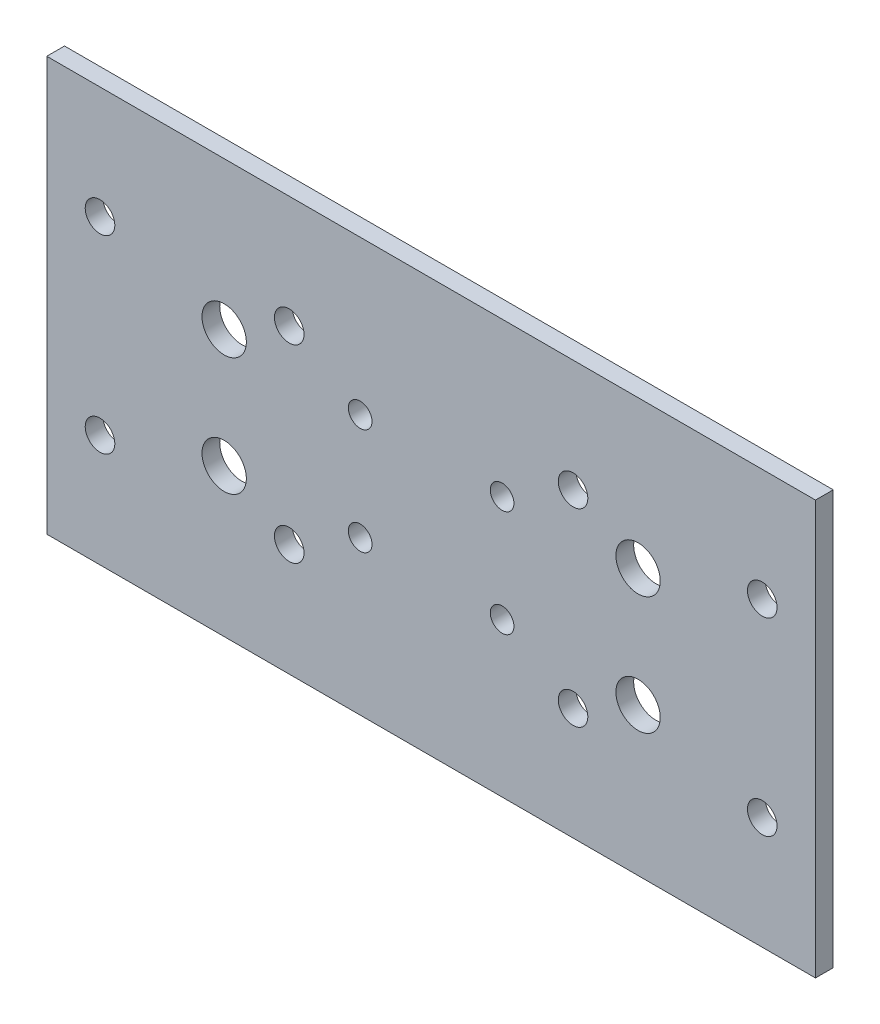
ISO-10303-21;
HEADER;
FILE_DESCRIPTION(('STEP AP214'),'2;1');
FILE_NAME('part.step','',(''),(''),'','','');
FILE_SCHEMA(('AUTOMOTIVE_DESIGN { 1 0 10303 214 1 1 1 1 }'));
ENDSEC;
DATA;
#1=APPLICATION_CONTEXT('core data for automotive mechanical design processes');
#2=APPLICATION_PROTOCOL_DEFINITION('international standard','automotive_design',2000,#1);
#3=PRODUCT_CONTEXT('',#1,'mechanical');
#4=PRODUCT('Part','Part','',(#3));
#5=PRODUCT_RELATED_PRODUCT_CATEGORY('part','',(#4));
#6=PRODUCT_DEFINITION_FORMATION('','',#4);
#7=PRODUCT_DEFINITION_CONTEXT('part definition',#1,'design');
#8=PRODUCT_DEFINITION('design','',#6,#7);
#9=PRODUCT_DEFINITION_SHAPE('','',#8);
#10=(LENGTH_UNIT() NAMED_UNIT(*) SI_UNIT(.MILLI.,.METRE.));
#11=(NAMED_UNIT(*) PLANE_ANGLE_UNIT() SI_UNIT($,.RADIAN.));
#12=(NAMED_UNIT(*) SI_UNIT($,.STERADIAN.) SOLID_ANGLE_UNIT());
#13=UNCERTAINTY_MEASURE_WITH_UNIT(LENGTH_MEASURE(1.E-05),#10,'distance_accuracy_value','');
#14=(GEOMETRIC_REPRESENTATION_CONTEXT(3) GLOBAL_UNCERTAINTY_ASSIGNED_CONTEXT((#13)) GLOBAL_UNIT_ASSIGNED_CONTEXT((#10,
#11,#12)) REPRESENTATION_CONTEXT('',''));
#15=CARTESIAN_POINT('',(0.,0.,0.));
#16=DIRECTION('',(0.,0.,1.));
#17=DIRECTION('',(1.,0.,0.));
#18=AXIS2_PLACEMENT_3D('',#15,#16,#17);
#19=CARTESIAN_POINT('',(65.,-35.,3.));
#20=DIRECTION('',(-1.,0.,0.));
#21=DIRECTION('',(0.,0.,1.));
#22=AXIS2_PLACEMENT_3D('',#19,#20,#21);
#23=PLANE('',#22);
#24=DIRECTION('',(0.,1.,0.));
#25=VECTOR('',#24,1.);
#26=CARTESIAN_POINT('',(65.,-35.,0.));
#27=LINE('',#26,#25);
#28=CARTESIAN_POINT('',(65.,-35.,0.));
#29=VERTEX_POINT('',#28);
#30=CARTESIAN_POINT('',(65.,35.,0.));
#31=VERTEX_POINT('',#30);
#32=EDGE_CURVE('E104',#29,#31,#27,.T.);
#33=ORIENTED_EDGE('',*,*,#32,.T.);
#34=DIRECTION('',(0.,0.,-1.));
#35=VECTOR('',#34,1.);
#36=CARTESIAN_POINT('',(65.,35.,3.));
#37=LINE('',#36,#35);
#38=CARTESIAN_POINT('',(65.,35.,3.));
#39=VERTEX_POINT('',#38);
#40=EDGE_CURVE('E11',#39,#31,#37,.T.);
#41=ORIENTED_EDGE('',*,*,#40,.F.);
#42=DIRECTION('',(0.,1.,0.));
#43=VECTOR('',#42,1.);
#44=CARTESIAN_POINT('',(65.,-35.,3.));
#45=LINE('',#44,#43);
#46=CARTESIAN_POINT('',(65.,-35.,3.));
#47=VERTEX_POINT('',#46);
#48=EDGE_CURVE('E92',#47,#39,#45,.T.);
#49=ORIENTED_EDGE('',*,*,#48,.F.);
#50=DIRECTION('',(0.,0.,-1.));
#51=VECTOR('',#50,1.);
#52=CARTESIAN_POINT('',(65.,-35.,3.));
#53=LINE('',#52,#51);
#54=EDGE_CURVE('E100',#47,#29,#53,.T.);
#55=ORIENTED_EDGE('',*,*,#54,.T.);
#56=EDGE_LOOP('',(#33,#41,#49,#55));
#57=FACE_BOUND('',#56,.T.);
#58=ADVANCED_FACE('F41',(#57),#23,.F.);
#59=CARTESIAN_POINT('',(-65.,35.,3.));
#60=DIRECTION('',(0.,-1.,0.));
#61=DIRECTION('',(0.,0.,-1.));
#62=AXIS2_PLACEMENT_3D('',#59,#60,#61);
#63=PLANE('',#62);
#64=DIRECTION('',(-1.,0.,0.));
#65=VECTOR('',#64,1.);
#66=CARTESIAN_POINT('',(-65.,35.,0.));
#67=LINE('',#66,#65);
#68=CARTESIAN_POINT('',(-65.,35.,0.));
#69=VERTEX_POINT('',#68);
#70=EDGE_CURVE('E96',#31,#69,#67,.T.);
#71=ORIENTED_EDGE('',*,*,#70,.T.);
#72=DIRECTION('',(0.,0.,-1.));
#73=VECTOR('',#72,1.);
#74=CARTESIAN_POINT('',(-65.,35.,3.));
#75=LINE('',#74,#73);
#76=CARTESIAN_POINT('',(-65.,35.,3.));
#77=VERTEX_POINT('',#76);
#78=EDGE_CURVE('E49',#77,#69,#75,.T.);
#79=ORIENTED_EDGE('',*,*,#78,.F.);
#80=DIRECTION('',(-1.,0.,0.));
#81=VECTOR('',#80,1.);
#82=CARTESIAN_POINT('',(-65.,35.,3.));
#83=LINE('',#82,#81);
#84=EDGE_CURVE('E87',#39,#77,#83,.T.);
#85=ORIENTED_EDGE('',*,*,#84,.F.);
#86=ORIENTED_EDGE('',*,*,#40,.T.);
#87=EDGE_LOOP('',(#71,#79,#85,#86));
#88=FACE_BOUND('',#87,.T.);
#89=ADVANCED_FACE('F95',(#88),#63,.F.);
#90=CARTESIAN_POINT('',(-65.,-35.,3.));
#91=DIRECTION('',(1.,0.,0.));
#92=DIRECTION('',(0.,0.,-1.));
#93=AXIS2_PLACEMENT_3D('',#90,#91,#92);
#94=PLANE('',#93);
#95=DIRECTION('',(0.,-1.,0.));
#96=VECTOR('',#95,1.);
#97=CARTESIAN_POINT('',(-65.,-35.,0.));
#98=LINE('',#97,#96);
#99=CARTESIAN_POINT('',(-65.,-35.,0.));
#100=VERTEX_POINT('',#99);
#101=EDGE_CURVE('E74',#69,#100,#98,.T.);
#102=ORIENTED_EDGE('',*,*,#101,.T.);
#103=DIRECTION('',(0.,0.,-1.));
#104=VECTOR('',#103,1.);
#105=CARTESIAN_POINT('',(-65.,-35.,3.));
#106=LINE('',#105,#104);
#107=CARTESIAN_POINT('',(-65.,-35.,3.));
#108=VERTEX_POINT('',#107);
#109=EDGE_CURVE('E97',#108,#100,#106,.T.);
#110=ORIENTED_EDGE('',*,*,#109,.F.);
#111=DIRECTION('',(0.,-1.,0.));
#112=VECTOR('',#111,1.);
#113=CARTESIAN_POINT('',(-65.,-35.,3.));
#114=LINE('',#113,#112);
#115=EDGE_CURVE('E90',#77,#108,#114,.T.);
#116=ORIENTED_EDGE('',*,*,#115,.F.);
#117=ORIENTED_EDGE('',*,*,#78,.T.);
#118=EDGE_LOOP('',(#102,#110,#116,#117));
#119=FACE_BOUND('',#118,.T.);
#120=ADVANCED_FACE('F98',(#119),#94,.F.);
#121=CARTESIAN_POINT('',(-65.,-35.,3.));
#122=DIRECTION('',(0.,1.,0.));
#123=DIRECTION('',(0.,0.,1.));
#124=AXIS2_PLACEMENT_3D('',#121,#122,#123);
#125=PLANE('',#124);
#126=DIRECTION('',(1.,0.,0.));
#127=VECTOR('',#126,1.);
#128=CARTESIAN_POINT('',(-65.,-35.,0.));
#129=LINE('',#128,#127);
#130=EDGE_CURVE('E80',#100,#29,#129,.T.);
#131=ORIENTED_EDGE('',*,*,#130,.T.);
#132=ORIENTED_EDGE('',*,*,#54,.F.);
#133=DIRECTION('',(1.,0.,0.));
#134=VECTOR('',#133,1.);
#135=CARTESIAN_POINT('',(-65.,-35.,3.));
#136=LINE('',#135,#134);
#137=EDGE_CURVE('E57',#108,#47,#136,.T.);
#138=ORIENTED_EDGE('',*,*,#137,.F.);
#139=ORIENTED_EDGE('',*,*,#109,.T.);
#140=EDGE_LOOP('',(#131,#132,#138,#139));
#141=FACE_BOUND('',#140,.T.);
#142=ADVANCED_FACE('F112',(#141),#125,.F.);
#143=CARTESIAN_POINT('',(0.,0.,3.));
#144=DIRECTION('',(0.,0.,-1.));
#145=DIRECTION('',(-1.,0.,0.));
#146=AXIS2_PLACEMENT_3D('',#143,#144,#145);
#147=PLANE('',#146);
#148=CARTESIAN_POINT('',(-35.,-10.,3.));
#149=DIRECTION('',(0.,0.,-1.));
#150=DIRECTION('',(-1.,0.,0.));
#151=AXIS2_PLACEMENT_3D('',#148,#149,#150);
#152=CIRCLE('',#151,3.75);
#153=CARTESIAN_POINT('',(-38.75,-10.,3.));
#154=VERTEX_POINT('',#153);
#155=EDGE_CURVE('E199',#154,#154,#152,.T.);
#156=ORIENTED_EDGE('',*,*,#155,.T.);
#157=EDGE_LOOP('',(#156));
#158=FACE_BOUND('',#157,.T.);
#159=CARTESIAN_POINT('',(35.,-10.,3.));
#160=DIRECTION('',(0.,0.,-1.));
#161=DIRECTION('',(-1.,0.,0.));
#162=AXIS2_PLACEMENT_3D('',#159,#160,#161);
#163=CIRCLE('',#162,3.75);
#164=CARTESIAN_POINT('',(31.25,-10.,3.));
#165=VERTEX_POINT('',#164);
#166=EDGE_CURVE('E205',#165,#165,#163,.T.);
#167=ORIENTED_EDGE('',*,*,#166,.T.);
#168=EDGE_LOOP('',(#167));
#169=FACE_BOUND('',#168,.T.);
#170=CARTESIAN_POINT('',(35.,10.,3.));
#171=DIRECTION('',(0.,0.,-1.));
#172=DIRECTION('',(-1.,0.,0.));
#173=AXIS2_PLACEMENT_3D('',#170,#171,#172);
#174=CIRCLE('',#173,3.75);
#175=CARTESIAN_POINT('',(31.25,10.,3.));
#176=VERTEX_POINT('',#175);
#177=EDGE_CURVE('E193',#176,#176,#174,.T.);
#178=ORIENTED_EDGE('',*,*,#177,.T.);
#179=EDGE_LOOP('',(#178));
#180=FACE_BOUND('',#179,.T.);
#181=CARTESIAN_POINT('',(-35.,10.,3.));
#182=DIRECTION('',(0.,0.,-1.));
#183=DIRECTION('',(-1.,0.,0.));
#184=AXIS2_PLACEMENT_3D('',#181,#182,#183);
#185=CIRCLE('',#184,3.75);
#186=CARTESIAN_POINT('',(-38.75,10.,3.));
#187=VERTEX_POINT('',#186);
#188=EDGE_CURVE('E176',#187,#187,#185,.T.);
#189=ORIENTED_EDGE('',*,*,#188,.T.);
#190=EDGE_LOOP('',(#189));
#191=FACE_BOUND('',#190,.T.);
#192=CARTESIAN_POINT('',(-12.,9.,3.));
#193=DIRECTION('',(0.,0.,-1.));
#194=DIRECTION('',(-1.,0.,0.));
#195=AXIS2_PLACEMENT_3D('',#192,#193,#194);
#196=CIRCLE('',#195,2.);
#197=CARTESIAN_POINT('',(-14.,9.,3.));
#198=VERTEX_POINT('',#197);
#199=EDGE_CURVE('E151',#198,#198,#196,.T.);
#200=ORIENTED_EDGE('',*,*,#199,.T.);
#201=EDGE_LOOP('',(#200));
#202=FACE_BOUND('',#201,.T.);
#203=CARTESIAN_POINT('',(56.0000000000001,15.9999999999996,3.));
#204=DIRECTION('',(0.,0.,-1.));
#205=DIRECTION('',(1.,0.,0.));
#206=AXIS2_PLACEMENT_3D('',#203,#204,#205);
#207=CIRCLE('',#206,2.50000000000002);
#208=CARTESIAN_POINT('',(58.5000000000001,15.9999999999996,3.));
#209=VERTEX_POINT('',#208);
#210=EDGE_CURVE('E158',#209,#209,#207,.T.);
#211=ORIENTED_EDGE('',*,*,#210,.T.);
#212=EDGE_LOOP('',(#211));
#213=FACE_BOUND('',#212,.T.);
#214=CARTESIAN_POINT('',(55.9999999999999,-16.0000000000004,3.));
#215=DIRECTION('',(0.,0.,-1.));
#216=DIRECTION('',(1.,0.,0.));
#217=AXIS2_PLACEMENT_3D('',#214,#215,#216);
#218=CIRCLE('',#217,2.5);
#219=CARTESIAN_POINT('',(58.4999999999999,-16.0000000000004,3.));
#220=VERTEX_POINT('',#219);
#221=EDGE_CURVE('E164',#220,#220,#218,.T.);
#222=ORIENTED_EDGE('',*,*,#221,.T.);
#223=EDGE_LOOP('',(#222));
#224=FACE_BOUND('',#223,.T.);
#225=CARTESIAN_POINT('',(23.9999999999999,-16.0000000000002,3.));
#226=DIRECTION('',(0.,0.,-1.));
#227=DIRECTION('',(1.,0.,0.));
#228=AXIS2_PLACEMENT_3D('',#225,#226,#227);
#229=CIRCLE('',#228,2.50000000000001);
#230=CARTESIAN_POINT('',(26.4999999999999,-16.0000000000002,3.));
#231=VERTEX_POINT('',#230);
#232=EDGE_CURVE('E128',#231,#231,#229,.T.);
#233=ORIENTED_EDGE('',*,*,#232,.T.);
#234=EDGE_LOOP('',(#233));
#235=FACE_BOUND('',#234,.T.);
#236=CARTESIAN_POINT('',(24.0000000000001,16.,3.));
#237=DIRECTION('',(0.,0.,-1.));
#238=DIRECTION('',(1.,0.,0.));
#239=AXIS2_PLACEMENT_3D('',#236,#237,#238);
#240=CIRCLE('',#239,2.5);
#241=CARTESIAN_POINT('',(26.5000000000001,16.,3.));
#242=VERTEX_POINT('',#241);
#243=EDGE_CURVE('E127',#242,#242,#240,.T.);
#244=ORIENTED_EDGE('',*,*,#243,.T.);
#245=EDGE_LOOP('',(#244));
#246=FACE_BOUND('',#245,.T.);
#247=CARTESIAN_POINT('',(-24.,16.,3.));
#248=DIRECTION('',(0.,0.,-1.));
#249=DIRECTION('',(-1.,0.,0.));
#250=AXIS2_PLACEMENT_3D('',#247,#248,#249);
#251=CIRCLE('',#250,2.5);
#252=CARTESIAN_POINT('',(-26.5,16.,3.));
#253=VERTEX_POINT('',#252);
#254=EDGE_CURVE('E134',#253,#253,#251,.T.);
#255=ORIENTED_EDGE('',*,*,#254,.T.);
#256=EDGE_LOOP('',(#255));
#257=FACE_BOUND('',#256,.T.);
#258=CARTESIAN_POINT('',(-24.,-16.,3.));
#259=DIRECTION('',(0.,0.,-1.));
#260=DIRECTION('',(-1.,0.,0.));
#261=AXIS2_PLACEMENT_3D('',#258,#259,#260);
#262=CIRCLE('',#261,2.5);
#263=CARTESIAN_POINT('',(-26.5,-16.,3.));
#264=VERTEX_POINT('',#263);
#265=EDGE_CURVE('E140',#264,#264,#262,.T.);
#266=ORIENTED_EDGE('',*,*,#265,.T.);
#267=EDGE_LOOP('',(#266));
#268=FACE_BOUND('',#267,.T.);
#269=CARTESIAN_POINT('',(-56.,-16.,3.));
#270=DIRECTION('',(0.,0.,-1.));
#271=DIRECTION('',(-1.,0.,0.));
#272=AXIS2_PLACEMENT_3D('',#269,#270,#271);
#273=CIRCLE('',#272,2.5);
#274=CARTESIAN_POINT('',(-58.5,-16.,3.));
#275=VERTEX_POINT('',#274);
#276=EDGE_CURVE('E121',#275,#275,#273,.T.);
#277=ORIENTED_EDGE('',*,*,#276,.T.);
#278=EDGE_LOOP('',(#277));
#279=FACE_BOUND('',#278,.T.);
#280=CARTESIAN_POINT('',(12.,9.,3.));
#281=DIRECTION('',(0.,0.,-1.));
#282=DIRECTION('',(1.,0.,0.));
#283=AXIS2_PLACEMENT_3D('',#280,#281,#282);
#284=CIRCLE('',#283,2.00000000000008);
#285=CARTESIAN_POINT('',(14.0000000000001,9.,3.));
#286=VERTEX_POINT('',#285);
#287=EDGE_CURVE('E152',#286,#286,#284,.T.);
#288=ORIENTED_EDGE('',*,*,#287,.T.);
#289=EDGE_LOOP('',(#288));
#290=FACE_BOUND('',#289,.T.);
#291=CARTESIAN_POINT('',(12.,-9.,3.));
#292=DIRECTION('',(0.,0.,-1.));
#293=DIRECTION('',(-1.,0.,0.));
#294=AXIS2_PLACEMENT_3D('',#291,#292,#293);
#295=CIRCLE('',#294,2.00000000000008);
#296=CARTESIAN_POINT('',(9.99999999999992,-9.,3.));
#297=VERTEX_POINT('',#296);
#298=EDGE_CURVE('E182',#297,#297,#295,.T.);
#299=ORIENTED_EDGE('',*,*,#298,.T.);
#300=EDGE_LOOP('',(#299));
#301=FACE_BOUND('',#300,.T.);
#302=CARTESIAN_POINT('',(-12.,-9.,3.));
#303=DIRECTION('',(0.,0.,-1.));
#304=DIRECTION('',(1.,0.,0.));
#305=AXIS2_PLACEMENT_3D('',#302,#303,#304);
#306=CIRCLE('',#305,2.);
#307=CARTESIAN_POINT('',(-10.,-9.,3.));
#308=VERTEX_POINT('',#307);
#309=EDGE_CURVE('E175',#308,#308,#306,.T.);
#310=ORIENTED_EDGE('',*,*,#309,.T.);
#311=EDGE_LOOP('',(#310));
#312=FACE_BOUND('',#311,.T.);
#313=CARTESIAN_POINT('',(-56.,16.,3.));
#314=DIRECTION('',(0.,0.,-1.));
#315=DIRECTION('',(-1.,0.,0.));
#316=AXIS2_PLACEMENT_3D('',#313,#314,#315);
#317=CIRCLE('',#316,2.5);
#318=CARTESIAN_POINT('',(-58.5,16.,3.));
#319=VERTEX_POINT('',#318);
#320=EDGE_CURVE('E107',#319,#319,#317,.T.);
#321=ORIENTED_EDGE('',*,*,#320,.T.);
#322=EDGE_LOOP('',(#321));
#323=FACE_BOUND('',#322,.T.);
#324=ORIENTED_EDGE('',*,*,#48,.T.);
#325=ORIENTED_EDGE('',*,*,#84,.T.);
#326=ORIENTED_EDGE('',*,*,#115,.T.);
#327=ORIENTED_EDGE('',*,*,#137,.T.);
#328=EDGE_LOOP('',(#324,#325,#326,#327));
#329=FACE_BOUND('',#328,.T.);
#330=ADVANCED_FACE('F88',(#158,#169,#180,#191,#202,#213,#224,#235,#246,#257,#268,#279,#290,#301,
#312,#323,#329),#147,.F.);
#331=CARTESIAN_POINT('',(0.,0.,0.));
#332=DIRECTION('',(0.,0.,-1.));
#333=DIRECTION('',(-1.,0.,0.));
#334=AXIS2_PLACEMENT_3D('',#331,#332,#333);
#335=PLANE('',#334);
#336=CARTESIAN_POINT('',(-35.,-10.,0.));
#337=DIRECTION('',(0.,0.,-1.));
#338=DIRECTION('',(-1.,0.,0.));
#339=AXIS2_PLACEMENT_3D('',#336,#337,#338);
#340=CIRCLE('',#339,3.75);
#341=CARTESIAN_POINT('',(-38.75,-10.,0.));
#342=VERTEX_POINT('',#341);
#343=EDGE_CURVE('E196',#342,#342,#340,.T.);
#344=ORIENTED_EDGE('',*,*,#343,.F.);
#345=EDGE_LOOP('',(#344));
#346=FACE_BOUND('',#345,.T.);
#347=CARTESIAN_POINT('',(35.,-10.,0.));
#348=DIRECTION('',(0.,0.,-1.));
#349=DIRECTION('',(-1.,0.,0.));
#350=AXIS2_PLACEMENT_3D('',#347,#348,#349);
#351=CIRCLE('',#350,3.75);
#352=CARTESIAN_POINT('',(31.25,-10.,0.));
#353=VERTEX_POINT('',#352);
#354=EDGE_CURVE('E202',#353,#353,#351,.T.);
#355=ORIENTED_EDGE('',*,*,#354,.F.);
#356=EDGE_LOOP('',(#355));
#357=FACE_BOUND('',#356,.T.);
#358=CARTESIAN_POINT('',(35.,10.,0.));
#359=DIRECTION('',(0.,0.,-1.));
#360=DIRECTION('',(-1.,0.,0.));
#361=AXIS2_PLACEMENT_3D('',#358,#359,#360);
#362=CIRCLE('',#361,3.75);
#363=CARTESIAN_POINT('',(31.25,10.,0.));
#364=VERTEX_POINT('',#363);
#365=EDGE_CURVE('E208',#364,#364,#362,.T.);
#366=ORIENTED_EDGE('',*,*,#365,.F.);
#367=EDGE_LOOP('',(#366));
#368=FACE_BOUND('',#367,.T.);
#369=CARTESIAN_POINT('',(-35.,10.,0.));
#370=DIRECTION('',(0.,0.,-1.));
#371=DIRECTION('',(-1.,0.,0.));
#372=AXIS2_PLACEMENT_3D('',#369,#370,#371);
#373=CIRCLE('',#372,3.75);
#374=CARTESIAN_POINT('',(-38.75,10.,0.));
#375=VERTEX_POINT('',#374);
#376=EDGE_CURVE('E190',#375,#375,#373,.T.);
#377=ORIENTED_EDGE('',*,*,#376,.F.);
#378=EDGE_LOOP('',(#377));
#379=FACE_BOUND('',#378,.T.);
#380=CARTESIAN_POINT('',(-12.,9.,0.));
#381=DIRECTION('',(0.,0.,-1.));
#382=DIRECTION('',(-1.,0.,0.));
#383=AXIS2_PLACEMENT_3D('',#380,#381,#382);
#384=CIRCLE('',#383,2.);
#385=CARTESIAN_POINT('',(-14.,9.,0.));
#386=VERTEX_POINT('',#385);
#387=EDGE_CURVE('E148',#386,#386,#384,.T.);
#388=ORIENTED_EDGE('',*,*,#387,.F.);
#389=EDGE_LOOP('',(#388));
#390=FACE_BOUND('',#389,.T.);
#391=CARTESIAN_POINT('',(56.0000000000001,15.9999999999996,0.));
#392=DIRECTION('',(0.,0.,-1.));
#393=DIRECTION('',(1.,0.,0.));
#394=AXIS2_PLACEMENT_3D('',#391,#392,#393);
#395=CIRCLE('',#394,2.50000000000002);
#396=CARTESIAN_POINT('',(58.5000000000001,15.9999999999996,0.));
#397=VERTEX_POINT('',#396);
#398=EDGE_CURVE('E155',#397,#397,#395,.T.);
#399=ORIENTED_EDGE('',*,*,#398,.F.);
#400=EDGE_LOOP('',(#399));
#401=FACE_BOUND('',#400,.T.);
#402=CARTESIAN_POINT('',(55.9999999999999,-16.0000000000004,0.));
#403=DIRECTION('',(0.,0.,-1.));
#404=DIRECTION('',(1.,0.,0.));
#405=AXIS2_PLACEMENT_3D('',#402,#403,#404);
#406=CIRCLE('',#405,2.5);
#407=CARTESIAN_POINT('',(58.4999999999999,-16.0000000000004,0.));
#408=VERTEX_POINT('',#407);
#409=EDGE_CURVE('E161',#408,#408,#406,.T.);
#410=ORIENTED_EDGE('',*,*,#409,.F.);
#411=EDGE_LOOP('',(#410));
#412=FACE_BOUND('',#411,.T.);
#413=CARTESIAN_POINT('',(23.9999999999999,-16.0000000000002,0.));
#414=DIRECTION('',(0.,0.,-1.));
#415=DIRECTION('',(1.,0.,0.));
#416=AXIS2_PLACEMENT_3D('',#413,#414,#415);
#417=CIRCLE('',#416,2.50000000000001);
#418=CARTESIAN_POINT('',(26.4999999999999,-16.0000000000002,0.));
#419=VERTEX_POINT('',#418);
#420=EDGE_CURVE('E167',#419,#419,#417,.T.);
#421=ORIENTED_EDGE('',*,*,#420,.F.);
#422=EDGE_LOOP('',(#421));
#423=FACE_BOUND('',#422,.T.);
#424=CARTESIAN_POINT('',(24.0000000000001,16.,0.));
#425=DIRECTION('',(0.,0.,-1.));
#426=DIRECTION('',(1.,0.,0.));
#427=AXIS2_PLACEMENT_3D('',#424,#425,#426);
#428=CIRCLE('',#427,2.5);
#429=CARTESIAN_POINT('',(26.5000000000001,16.,0.));
#430=VERTEX_POINT('',#429);
#431=EDGE_CURVE('E124',#430,#430,#428,.T.);
#432=ORIENTED_EDGE('',*,*,#431,.F.);
#433=EDGE_LOOP('',(#432));
#434=FACE_BOUND('',#433,.T.);
#435=CARTESIAN_POINT('',(-24.,16.,0.));
#436=DIRECTION('',(0.,0.,-1.));
#437=DIRECTION('',(-1.,0.,0.));
#438=AXIS2_PLACEMENT_3D('',#435,#436,#437);
#439=CIRCLE('',#438,2.5);
#440=CARTESIAN_POINT('',(-26.5,16.,0.));
#441=VERTEX_POINT('',#440);
#442=EDGE_CURVE('E131',#441,#441,#439,.T.);
#443=ORIENTED_EDGE('',*,*,#442,.F.);
#444=EDGE_LOOP('',(#443));
#445=FACE_BOUND('',#444,.T.);
#446=CARTESIAN_POINT('',(-24.,-16.,0.));
#447=DIRECTION('',(0.,0.,-1.));
#448=DIRECTION('',(-1.,0.,0.));
#449=AXIS2_PLACEMENT_3D('',#446,#447,#448);
#450=CIRCLE('',#449,2.5);
#451=CARTESIAN_POINT('',(-26.5,-16.,0.));
#452=VERTEX_POINT('',#451);
#453=EDGE_CURVE('E137',#452,#452,#450,.T.);
#454=ORIENTED_EDGE('',*,*,#453,.F.);
#455=EDGE_LOOP('',(#454));
#456=FACE_BOUND('',#455,.T.);
#457=CARTESIAN_POINT('',(-56.,-16.,0.));
#458=DIRECTION('',(0.,0.,-1.));
#459=DIRECTION('',(-1.,0.,0.));
#460=AXIS2_PLACEMENT_3D('',#457,#458,#459);
#461=CIRCLE('',#460,2.5);
#462=CARTESIAN_POINT('',(-58.5,-16.,0.));
#463=VERTEX_POINT('',#462);
#464=EDGE_CURVE('E143',#463,#463,#461,.T.);
#465=ORIENTED_EDGE('',*,*,#464,.F.);
#466=EDGE_LOOP('',(#465));
#467=FACE_BOUND('',#466,.T.);
#468=CARTESIAN_POINT('',(12.,9.,0.));
#469=DIRECTION('',(0.,0.,-1.));
#470=DIRECTION('',(1.,0.,0.));
#471=AXIS2_PLACEMENT_3D('',#468,#469,#470);
#472=CIRCLE('',#471,2.00000000000008);
#473=CARTESIAN_POINT('',(14.0000000000001,9.,0.));
#474=VERTEX_POINT('',#473);
#475=EDGE_CURVE('E185',#474,#474,#472,.T.);
#476=ORIENTED_EDGE('',*,*,#475,.F.);
#477=EDGE_LOOP('',(#476));
#478=FACE_BOUND('',#477,.T.);
#479=CARTESIAN_POINT('',(12.,-9.,0.));
#480=DIRECTION('',(0.,0.,-1.));
#481=DIRECTION('',(-1.,0.,0.));
#482=AXIS2_PLACEMENT_3D('',#479,#480,#481);
#483=CIRCLE('',#482,2.00000000000008);
#484=CARTESIAN_POINT('',(9.99999999999992,-9.,0.));
#485=VERTEX_POINT('',#484);
#486=EDGE_CURVE('E179',#485,#485,#483,.T.);
#487=ORIENTED_EDGE('',*,*,#486,.F.);
#488=EDGE_LOOP('',(#487));
#489=FACE_BOUND('',#488,.T.);
#490=CARTESIAN_POINT('',(-12.,-9.,0.));
#491=DIRECTION('',(0.,0.,-1.));
#492=DIRECTION('',(1.,0.,0.));
#493=AXIS2_PLACEMENT_3D('',#490,#491,#492);
#494=CIRCLE('',#493,2.);
#495=CARTESIAN_POINT('',(-10.,-9.,0.));
#496=VERTEX_POINT('',#495);
#497=EDGE_CURVE('E172',#496,#496,#494,.T.);
#498=ORIENTED_EDGE('',*,*,#497,.F.);
#499=EDGE_LOOP('',(#498));
#500=FACE_BOUND('',#499,.T.);
#501=CARTESIAN_POINT('',(-56.,16.,0.));
#502=DIRECTION('',(0.,0.,-1.));
#503=DIRECTION('',(-1.,0.,0.));
#504=AXIS2_PLACEMENT_3D('',#501,#502,#503);
#505=CIRCLE('',#504,2.5);
#506=CARTESIAN_POINT('',(-58.5,16.,0.));
#507=VERTEX_POINT('',#506);
#508=EDGE_CURVE('E118',#507,#507,#505,.T.);
#509=ORIENTED_EDGE('',*,*,#508,.F.);
#510=EDGE_LOOP('',(#509));
#511=FACE_BOUND('',#510,.T.);
#512=ORIENTED_EDGE('',*,*,#32,.F.);
#513=ORIENTED_EDGE('',*,*,#130,.F.);
#514=ORIENTED_EDGE('',*,*,#101,.F.);
#515=ORIENTED_EDGE('',*,*,#70,.F.);
#516=EDGE_LOOP('',(#512,#513,#514,#515));
#517=FACE_BOUND('',#516,.T.);
#518=ADVANCED_FACE('F115',(#346,#357,#368,#379,#390,#401,#412,#423,#434,#445,#456,#467,#478,
#489,#500,#511,#517),#335,.T.);
#519=CARTESIAN_POINT('',(-56.,16.,3.));
#520=DIRECTION('',(0.,0.,-1.));
#521=DIRECTION('',(-1.,0.,0.));
#522=AXIS2_PLACEMENT_3D('',#519,#520,#521);
#523=CYLINDRICAL_SURFACE('',#522,2.5);
#524=ORIENTED_EDGE('',*,*,#320,.F.);
#525=EDGE_LOOP('',(#524));
#526=FACE_BOUND('',#525,.T.);
#527=ORIENTED_EDGE('',*,*,#508,.T.);
#528=EDGE_LOOP('',(#527));
#529=FACE_BOUND('',#528,.T.);
#530=ADVANCED_FACE('F226',(#526,#529),#523,.F.);
#531=CARTESIAN_POINT('',(-12.,-9.,3.));
#532=DIRECTION('',(0.,0.,-1.));
#533=DIRECTION('',(-1.,0.,0.));
#534=AXIS2_PLACEMENT_3D('',#531,#532,#533);
#535=CYLINDRICAL_SURFACE('',#534,2.);
#536=ORIENTED_EDGE('',*,*,#309,.F.);
#537=EDGE_LOOP('',(#536));
#538=FACE_BOUND('',#537,.T.);
#539=ORIENTED_EDGE('',*,*,#497,.T.);
#540=EDGE_LOOP('',(#539));
#541=FACE_BOUND('',#540,.T.);
#542=ADVANCED_FACE('F256',(#538,#541),#535,.F.);
#543=CARTESIAN_POINT('',(12.,-9.,3.));
#544=DIRECTION('',(0.,0.,-1.));
#545=DIRECTION('',(-1.,0.,0.));
#546=AXIS2_PLACEMENT_3D('',#543,#544,#545);
#547=CYLINDRICAL_SURFACE('',#546,2.00000000000008);
#548=ORIENTED_EDGE('',*,*,#298,.F.);
#549=EDGE_LOOP('',(#548));
#550=FACE_BOUND('',#549,.T.);
#551=ORIENTED_EDGE('',*,*,#486,.T.);
#552=EDGE_LOOP('',(#551));
#553=FACE_BOUND('',#552,.T.);
#554=ADVANCED_FACE('F262',(#550,#553),#547,.F.);
#555=CARTESIAN_POINT('',(12.,9.,3.));
#556=DIRECTION('',(0.,0.,-1.));
#557=DIRECTION('',(-1.,0.,0.));
#558=AXIS2_PLACEMENT_3D('',#555,#556,#557);
#559=CYLINDRICAL_SURFACE('',#558,2.00000000000008);
#560=ORIENTED_EDGE('',*,*,#287,.F.);
#561=EDGE_LOOP('',(#560));
#562=FACE_BOUND('',#561,.T.);
#563=ORIENTED_EDGE('',*,*,#475,.T.);
#564=EDGE_LOOP('',(#563));
#565=FACE_BOUND('',#564,.T.);
#566=ADVANCED_FACE('F302',(#562,#565),#559,.F.);
#567=CARTESIAN_POINT('',(-56.,-16.,3.));
#568=DIRECTION('',(0.,0.,-1.));
#569=DIRECTION('',(-1.,0.,0.));
#570=AXIS2_PLACEMENT_3D('',#567,#568,#569);
#571=CYLINDRICAL_SURFACE('',#570,2.5);
#572=ORIENTED_EDGE('',*,*,#276,.F.);
#573=EDGE_LOOP('',(#572));
#574=FACE_BOUND('',#573,.T.);
#575=ORIENTED_EDGE('',*,*,#464,.T.);
#576=EDGE_LOOP('',(#575));
#577=FACE_BOUND('',#576,.T.);
#578=ADVANCED_FACE('F305',(#574,#577),#571,.F.);
#579=CARTESIAN_POINT('',(-24.,-16.,3.));
#580=DIRECTION('',(0.,0.,-1.));
#581=DIRECTION('',(-1.,0.,0.));
#582=AXIS2_PLACEMENT_3D('',#579,#580,#581);
#583=CYLINDRICAL_SURFACE('',#582,2.5);
#584=ORIENTED_EDGE('',*,*,#265,.F.);
#585=EDGE_LOOP('',(#584));
#586=FACE_BOUND('',#585,.T.);
#587=ORIENTED_EDGE('',*,*,#453,.T.);
#588=EDGE_LOOP('',(#587));
#589=FACE_BOUND('',#588,.T.);
#590=ADVANCED_FACE('F328',(#586,#589),#583,.F.);
#591=CARTESIAN_POINT('',(-24.,16.,3.));
#592=DIRECTION('',(0.,0.,-1.));
#593=DIRECTION('',(-1.,0.,0.));
#594=AXIS2_PLACEMENT_3D('',#591,#592,#593);
#595=CYLINDRICAL_SURFACE('',#594,2.5);
#596=ORIENTED_EDGE('',*,*,#254,.F.);
#597=EDGE_LOOP('',(#596));
#598=FACE_BOUND('',#597,.T.);
#599=ORIENTED_EDGE('',*,*,#442,.T.);
#600=EDGE_LOOP('',(#599));
#601=FACE_BOUND('',#600,.T.);
#602=ADVANCED_FACE('F332',(#598,#601),#595,.F.);
#603=CARTESIAN_POINT('',(24.0000000000001,16.,3.));
#604=DIRECTION('',(0.,0.,-1.));
#605=DIRECTION('',(-1.,0.,0.));
#606=AXIS2_PLACEMENT_3D('',#603,#604,#605);
#607=CYLINDRICAL_SURFACE('',#606,2.5);
#608=ORIENTED_EDGE('',*,*,#243,.F.);
#609=EDGE_LOOP('',(#608));
#610=FACE_BOUND('',#609,.T.);
#611=ORIENTED_EDGE('',*,*,#431,.T.);
#612=EDGE_LOOP('',(#611));
#613=FACE_BOUND('',#612,.T.);
#614=ADVANCED_FACE('F314',(#610,#613),#607,.F.);
#615=CARTESIAN_POINT('',(23.9999999999999,-16.0000000000002,3.));
#616=DIRECTION('',(0.,0.,-1.));
#617=DIRECTION('',(-1.,0.,0.));
#618=AXIS2_PLACEMENT_3D('',#615,#616,#617);
#619=CYLINDRICAL_SURFACE('',#618,2.50000000000001);
#620=ORIENTED_EDGE('',*,*,#232,.F.);
#621=EDGE_LOOP('',(#620));
#622=FACE_BOUND('',#621,.T.);
#623=ORIENTED_EDGE('',*,*,#420,.T.);
#624=EDGE_LOOP('',(#623));
#625=FACE_BOUND('',#624,.T.);
#626=ADVANCED_FACE('F310',(#622,#625),#619,.F.);
#627=CARTESIAN_POINT('',(55.9999999999999,-16.0000000000004,3.));
#628=DIRECTION('',(0.,0.,-1.));
#629=DIRECTION('',(-1.,0.,0.));
#630=AXIS2_PLACEMENT_3D('',#627,#628,#629);
#631=CYLINDRICAL_SURFACE('',#630,2.5);
#632=ORIENTED_EDGE('',*,*,#221,.F.);
#633=EDGE_LOOP('',(#632));
#634=FACE_BOUND('',#633,.T.);
#635=ORIENTED_EDGE('',*,*,#409,.T.);
#636=EDGE_LOOP('',(#635));
#637=FACE_BOUND('',#636,.T.);
#638=ADVANCED_FACE('F313',(#634,#637),#631,.F.);
#639=CARTESIAN_POINT('',(56.0000000000001,15.9999999999996,3.));
#640=DIRECTION('',(0.,0.,-1.));
#641=DIRECTION('',(-1.,0.,0.));
#642=AXIS2_PLACEMENT_3D('',#639,#640,#641);
#643=CYLINDRICAL_SURFACE('',#642,2.50000000000002);
#644=ORIENTED_EDGE('',*,*,#210,.F.);
#645=EDGE_LOOP('',(#644));
#646=FACE_BOUND('',#645,.T.);
#647=ORIENTED_EDGE('',*,*,#398,.T.);
#648=EDGE_LOOP('',(#647));
#649=FACE_BOUND('',#648,.T.);
#650=ADVANCED_FACE('F318',(#646,#649),#643,.F.);
#651=CARTESIAN_POINT('',(-12.,9.,3.));
#652=DIRECTION('',(0.,0.,-1.));
#653=DIRECTION('',(-1.,0.,0.));
#654=AXIS2_PLACEMENT_3D('',#651,#652,#653);
#655=CYLINDRICAL_SURFACE('',#654,2.);
#656=ORIENTED_EDGE('',*,*,#199,.F.);
#657=EDGE_LOOP('',(#656));
#658=FACE_BOUND('',#657,.T.);
#659=ORIENTED_EDGE('',*,*,#387,.T.);
#660=EDGE_LOOP('',(#659));
#661=FACE_BOUND('',#660,.T.);
#662=ADVANCED_FACE('F300',(#658,#661),#655,.F.);
#663=CARTESIAN_POINT('',(-35.,10.,3.));
#664=DIRECTION('',(0.,0.,-1.));
#665=DIRECTION('',(-1.,0.,0.));
#666=AXIS2_PLACEMENT_3D('',#663,#664,#665);
#667=CYLINDRICAL_SURFACE('',#666,3.75);
#668=ORIENTED_EDGE('',*,*,#188,.F.);
#669=EDGE_LOOP('',(#668));
#670=FACE_BOUND('',#669,.T.);
#671=ORIENTED_EDGE('',*,*,#376,.T.);
#672=EDGE_LOOP('',(#671));
#673=FACE_BOUND('',#672,.T.);
#674=ADVANCED_FACE('F220',(#670,#673),#667,.F.);
#675=CARTESIAN_POINT('',(35.,10.,3.));
#676=DIRECTION('',(0.,0.,-1.));
#677=DIRECTION('',(-1.,0.,0.));
#678=AXIS2_PLACEMENT_3D('',#675,#676,#677);
#679=CYLINDRICAL_SURFACE('',#678,3.75);
#680=ORIENTED_EDGE('',*,*,#177,.F.);
#681=EDGE_LOOP('',(#680));
#682=FACE_BOUND('',#681,.T.);
#683=ORIENTED_EDGE('',*,*,#365,.T.);
#684=EDGE_LOOP('',(#683));
#685=FACE_BOUND('',#684,.T.);
#686=ADVANCED_FACE('F216',(#682,#685),#679,.F.);
#687=CARTESIAN_POINT('',(35.,-10.,3.));
#688=DIRECTION('',(0.,0.,-1.));
#689=DIRECTION('',(-1.,0.,0.));
#690=AXIS2_PLACEMENT_3D('',#687,#688,#689);
#691=CYLINDRICAL_SURFACE('',#690,3.75);
#692=ORIENTED_EDGE('',*,*,#166,.F.);
#693=EDGE_LOOP('',(#692));
#694=FACE_BOUND('',#693,.T.);
#695=ORIENTED_EDGE('',*,*,#354,.T.);
#696=EDGE_LOOP('',(#695));
#697=FACE_BOUND('',#696,.T.);
#698=ADVANCED_FACE('F219',(#694,#697),#691,.F.);
#699=CARTESIAN_POINT('',(-35.,-10.,3.));
#700=DIRECTION('',(0.,0.,-1.));
#701=DIRECTION('',(-1.,0.,0.));
#702=AXIS2_PLACEMENT_3D('',#699,#700,#701);
#703=CYLINDRICAL_SURFACE('',#702,3.75);
#704=ORIENTED_EDGE('',*,*,#155,.F.);
#705=EDGE_LOOP('',(#704));
#706=FACE_BOUND('',#705,.T.);
#707=ORIENTED_EDGE('',*,*,#343,.T.);
#708=EDGE_LOOP('',(#707));
#709=FACE_BOUND('',#708,.T.);
#710=ADVANCED_FACE('F288',(#706,#709),#703,.F.);
#711=CLOSED_SHELL('',(#58,#89,#120,#142,#330,#518,#530,#542,#554,#566,#578,#590,#602,#614,#626,
#638,#650,#662,#674,#686,#698,#710));
#712=MANIFOLD_SOLID_BREP('B2',#711);
#713=ADVANCED_BREP_SHAPE_REPRESENTATION('',(#18,#712),#14);
#714=SHAPE_DEFINITION_REPRESENTATION(#9,#713);
ENDSEC;
END-ISO-10303-21;
